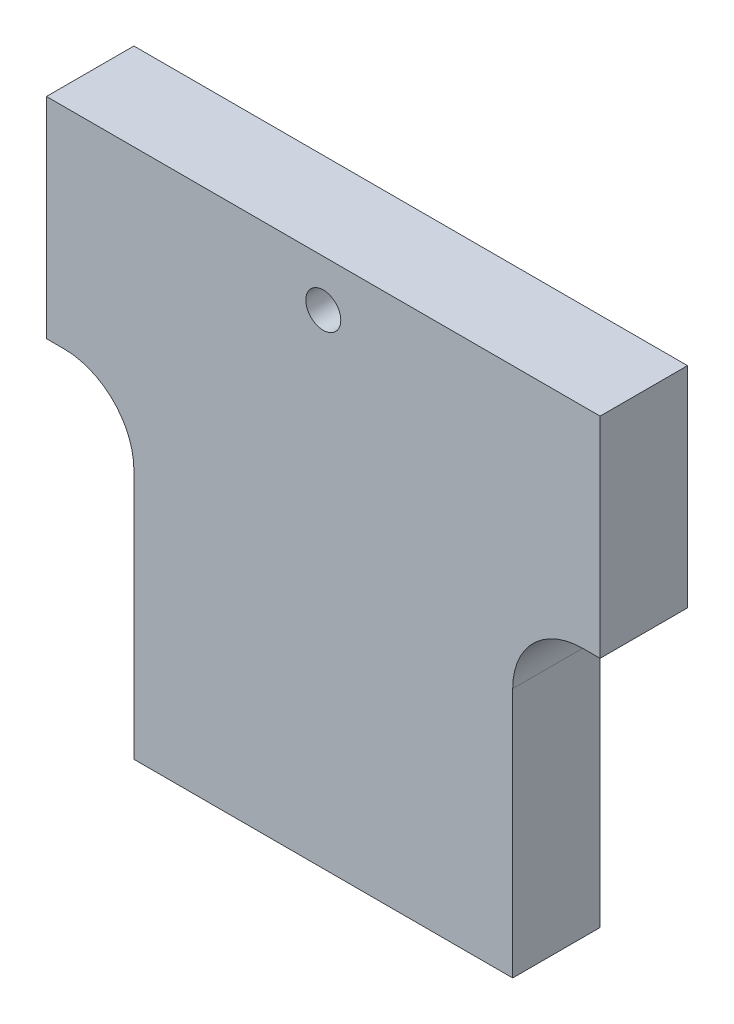
ISO-10303-21;
HEADER;
FILE_DESCRIPTION(('STEP AP214'),'2;1');
FILE_NAME('part.step','',(''),(''),'','','');
FILE_SCHEMA(('AUTOMOTIVE_DESIGN { 1 0 10303 214 1 1 1 1 }'));
ENDSEC;
DATA;
#1=APPLICATION_CONTEXT('core data for automotive mechanical design processes');
#2=APPLICATION_PROTOCOL_DEFINITION('international standard','automotive_design',2000,#1);
#3=PRODUCT_CONTEXT('',#1,'mechanical');
#4=PRODUCT('Part','Part','',(#3));
#5=PRODUCT_RELATED_PRODUCT_CATEGORY('part','',(#4));
#6=PRODUCT_DEFINITION_FORMATION('','',#4);
#7=PRODUCT_DEFINITION_CONTEXT('part definition',#1,'design');
#8=PRODUCT_DEFINITION('design','',#6,#7);
#9=PRODUCT_DEFINITION_SHAPE('','',#8);
#10=(LENGTH_UNIT() NAMED_UNIT(*) SI_UNIT(.MILLI.,.METRE.));
#11=(NAMED_UNIT(*) PLANE_ANGLE_UNIT() SI_UNIT($,.RADIAN.));
#12=(NAMED_UNIT(*) SI_UNIT($,.STERADIAN.) SOLID_ANGLE_UNIT());
#13=UNCERTAINTY_MEASURE_WITH_UNIT(LENGTH_MEASURE(1.E-05),#10,'distance_accuracy_value','');
#14=(GEOMETRIC_REPRESENTATION_CONTEXT(3) GLOBAL_UNCERTAINTY_ASSIGNED_CONTEXT((#13)) GLOBAL_UNIT_ASSIGNED_CONTEXT((#10,
#11,#12)) REPRESENTATION_CONTEXT('',''));
#15=CARTESIAN_POINT('',(0.,0.,0.));
#16=DIRECTION('',(0.,0.,1.));
#17=DIRECTION('',(1.,0.,0.));
#18=AXIS2_PLACEMENT_3D('',#15,#16,#17);
#19=CARTESIAN_POINT('',(0.,0.,150.));
#20=DIRECTION('',(1.,0.,0.));
#21=DIRECTION('',(0.,0.,-1.));
#22=AXIS2_PLACEMENT_3D('',#19,#20,#21);
#23=PLANE('',#22);
#24=DIRECTION('',(0.,-1.,0.));
#25=VECTOR('',#24,1.);
#26=CARTESIAN_POINT('',(0.,0.,0.));
#27=LINE('',#26,#25);
#28=CARTESIAN_POINT('',(0.,910.,0.));
#29=VERTEX_POINT('',#28);
#30=CARTESIAN_POINT('',(0.,550.,0.));
#31=VERTEX_POINT('',#30);
#32=EDGE_CURVE('E128',#29,#31,#27,.T.);
#33=ORIENTED_EDGE('',*,*,#32,.T.);
#34=DIRECTION('',(0.,0.,1.));
#35=VECTOR('',#34,1.);
#36=CARTESIAN_POINT('',(0.,550.,0.));
#37=LINE('',#36,#35);
#38=CARTESIAN_POINT('',(0.,550.,150.));
#39=VERTEX_POINT('',#38);
#40=EDGE_CURVE('E169',#31,#39,#37,.T.);
#41=ORIENTED_EDGE('',*,*,#40,.T.);
#42=DIRECTION('',(0.,-1.,0.));
#43=VECTOR('',#42,1.);
#44=CARTESIAN_POINT('',(0.,0.,150.));
#45=LINE('',#44,#43);
#46=CARTESIAN_POINT('',(0.,910.,150.));
#47=VERTEX_POINT('',#46);
#48=EDGE_CURVE('E121',#47,#39,#45,.T.);
#49=ORIENTED_EDGE('',*,*,#48,.F.);
#50=DIRECTION('',(0.,0.,1.));
#51=VECTOR('',#50,1.);
#52=CARTESIAN_POINT('',(0.,910.,0.));
#53=LINE('',#52,#51);
#54=EDGE_CURVE('E132',#29,#47,#53,.T.);
#55=ORIENTED_EDGE('',*,*,#54,.F.);
#56=EDGE_LOOP('',(#33,#41,#49,#55));
#57=FACE_BOUND('',#56,.T.);
#58=ADVANCED_FACE('F35',(#57),#23,.F.);
#59=CARTESIAN_POINT('',(0.,0.,150.));
#60=DIRECTION('',(0.,1.,0.));
#61=DIRECTION('',(0.,0.,1.));
#62=AXIS2_PLACEMENT_3D('',#59,#60,#61);
#63=PLANE('',#62);
#64=DIRECTION('',(1.,0.,0.));
#65=VECTOR('',#64,1.);
#66=CARTESIAN_POINT('',(0.,0.,0.));
#67=LINE('',#66,#65);
#68=CARTESIAN_POINT('',(150.,0.,0.));
#69=VERTEX_POINT('',#68);
#70=CARTESIAN_POINT('',(800.,0.,0.));
#71=VERTEX_POINT('',#70);
#72=EDGE_CURVE('E122',#69,#71,#67,.T.);
#73=ORIENTED_EDGE('',*,*,#72,.T.);
#74=DIRECTION('',(0.,0.,1.));
#75=VECTOR('',#74,1.);
#76=CARTESIAN_POINT('',(800.,0.,0.));
#77=LINE('',#76,#75);
#78=CARTESIAN_POINT('',(800.,0.,150.));
#79=VERTEX_POINT('',#78);
#80=EDGE_CURVE('E156',#71,#79,#77,.T.);
#81=ORIENTED_EDGE('',*,*,#80,.T.);
#82=DIRECTION('',(1.,0.,0.));
#83=VECTOR('',#82,1.);
#84=CARTESIAN_POINT('',(0.,0.,150.));
#85=LINE('',#84,#83);
#86=CARTESIAN_POINT('',(150.,0.,150.));
#87=VERTEX_POINT('',#86);
#88=EDGE_CURVE('E175',#87,#79,#85,.T.);
#89=ORIENTED_EDGE('',*,*,#88,.F.);
#90=DIRECTION('',(0.,0.,1.));
#91=VECTOR('',#90,1.);
#92=CARTESIAN_POINT('',(150.,0.,0.));
#93=LINE('',#92,#91);
#94=EDGE_CURVE('E166',#69,#87,#93,.T.);
#95=ORIENTED_EDGE('',*,*,#94,.F.);
#96=EDGE_LOOP('',(#73,#81,#89,#95));
#97=FACE_BOUND('',#96,.T.);
#98=ADVANCED_FACE('F220',(#97),#63,.F.);
#99=CARTESIAN_POINT('',(950.,0.,150.));
#100=DIRECTION('',(-1.,0.,0.));
#101=DIRECTION('',(0.,0.,1.));
#102=AXIS2_PLACEMENT_3D('',#99,#100,#101);
#103=PLANE('',#102);
#104=DIRECTION('',(0.,1.,0.));
#105=VECTOR('',#104,1.);
#106=CARTESIAN_POINT('',(950.,0.,150.));
#107=LINE('',#106,#105);
#108=CARTESIAN_POINT('',(950.,550.,150.));
#109=VERTEX_POINT('',#108);
#110=CARTESIAN_POINT('',(950.,910.,150.));
#111=VERTEX_POINT('',#110);
#112=EDGE_CURVE('E178',#109,#111,#107,.T.);
#113=ORIENTED_EDGE('',*,*,#112,.F.);
#114=DIRECTION('',(0.,0.,1.));
#115=VECTOR('',#114,1.);
#116=CARTESIAN_POINT('',(950.,550.,0.));
#117=LINE('',#116,#115);
#118=CARTESIAN_POINT('',(950.,550.,0.));
#119=VERTEX_POINT('',#118);
#120=EDGE_CURVE('E118',#119,#109,#117,.T.);
#121=ORIENTED_EDGE('',*,*,#120,.F.);
#122=DIRECTION('',(0.,1.,0.));
#123=VECTOR('',#122,1.);
#124=CARTESIAN_POINT('',(950.,0.,0.));
#125=LINE('',#124,#123);
#126=CARTESIAN_POINT('',(950.,910.,0.));
#127=VERTEX_POINT('',#126);
#128=EDGE_CURVE('E112',#119,#127,#125,.T.);
#129=ORIENTED_EDGE('',*,*,#128,.T.);
#130=DIRECTION('',(0.,0.,-1.));
#131=VECTOR('',#130,1.);
#132=CARTESIAN_POINT('',(950.,910.,150.));
#133=LINE('',#132,#131);
#134=EDGE_CURVE('E117',#111,#127,#133,.T.);
#135=ORIENTED_EDGE('',*,*,#134,.F.);
#136=EDGE_LOOP('',(#113,#121,#129,#135));
#137=FACE_BOUND('',#136,.T.);
#138=ADVANCED_FACE('F115',(#137),#103,.F.);
#139=CARTESIAN_POINT('',(0.,0.,150.));
#140=DIRECTION('',(0.,0.,-1.));
#141=DIRECTION('',(-1.,0.,0.));
#142=AXIS2_PLACEMENT_3D('',#139,#140,#141);
#143=PLANE('',#142);
#144=CARTESIAN_POINT('',(475.,830.,150.));
#145=DIRECTION('',(0.,0.,1.));
#146=DIRECTION('',(1.,0.,0.));
#147=AXIS2_PLACEMENT_3D('',#144,#145,#146);
#148=CIRCLE('',#147,30.0000000000001);
#149=CARTESIAN_POINT('',(505.,830.,150.));
#150=VERTEX_POINT('',#149);
#151=EDGE_CURVE('E141',#150,#150,#148,.T.);
#152=ORIENTED_EDGE('',*,*,#151,.F.);
#153=EDGE_LOOP('',(#152));
#154=FACE_BOUND('',#153,.T.);
#155=ORIENTED_EDGE('',*,*,#88,.T.);
#156=DIRECTION('',(0.,-1.,0.));
#157=VECTOR('',#156,1.);
#158=CARTESIAN_POINT('',(800.,0.,150.));
#159=LINE('',#158,#157);
#160=CARTESIAN_POINT('',(800.,430.,150.));
#161=VERTEX_POINT('',#160);
#162=EDGE_CURVE('E151',#161,#79,#159,.T.);
#163=ORIENTED_EDGE('',*,*,#162,.F.);
#164=CARTESIAN_POINT('',(920.,430.,150.));
#165=DIRECTION('',(0.,0.,-1.));
#166=DIRECTION('',(-1.,0.,0.));
#167=AXIS2_PLACEMENT_3D('',#164,#165,#166);
#168=CIRCLE('',#167,120.);
#169=CARTESIAN_POINT('',(920.,550.,150.));
#170=VERTEX_POINT('',#169);
#171=EDGE_CURVE('E192',#161,#170,#168,.T.);
#172=ORIENTED_EDGE('',*,*,#171,.T.);
#173=DIRECTION('',(-1.,0.,0.));
#174=VECTOR('',#173,1.);
#175=CARTESIAN_POINT('',(950.,550.,150.));
#176=LINE('',#175,#174);
#177=EDGE_CURVE('E147',#109,#170,#176,.T.);
#178=ORIENTED_EDGE('',*,*,#177,.F.);
#179=ORIENTED_EDGE('',*,*,#112,.T.);
#180=DIRECTION('',(1.,0.,0.));
#181=VECTOR('',#180,1.);
#182=CARTESIAN_POINT('',(0.,910.,150.));
#183=LINE('',#182,#181);
#184=EDGE_CURVE('E137',#47,#111,#183,.T.);
#185=ORIENTED_EDGE('',*,*,#184,.F.);
#186=ORIENTED_EDGE('',*,*,#48,.T.);
#187=DIRECTION('',(-1.,0.,0.));
#188=VECTOR('',#187,1.);
#189=CARTESIAN_POINT('',(0.,550.,150.));
#190=LINE('',#189,#188);
#191=CARTESIAN_POINT('',(30.,550.,150.));
#192=VERTEX_POINT('',#191);
#193=EDGE_CURVE('E164',#192,#39,#190,.T.);
#194=ORIENTED_EDGE('',*,*,#193,.F.);
#195=CARTESIAN_POINT('',(30.,430.,150.));
#196=DIRECTION('',(0.,0.,-1.));
#197=DIRECTION('',(-1.,0.,0.));
#198=AXIS2_PLACEMENT_3D('',#195,#196,#197);
#199=CIRCLE('',#198,120.);
#200=CARTESIAN_POINT('',(150.,430.,150.));
#201=VERTEX_POINT('',#200);
#202=EDGE_CURVE('E43',#192,#201,#199,.T.);
#203=ORIENTED_EDGE('',*,*,#202,.T.);
#204=DIRECTION('',(0.,1.,0.));
#205=VECTOR('',#204,1.);
#206=CARTESIAN_POINT('',(150.,0.,150.));
#207=LINE('',#206,#205);
#208=EDGE_CURVE('E159',#87,#201,#207,.T.);
#209=ORIENTED_EDGE('',*,*,#208,.F.);
#210=EDGE_LOOP('',(#155,#163,#172,#178,#179,#185,#186,#194,#203,#209));
#211=FACE_BOUND('',#210,.T.);
#212=ADVANCED_FACE('F207',(#154,#211),#143,.F.);
#213=CARTESIAN_POINT('',(0.,0.,0.));
#214=DIRECTION('',(0.,0.,-1.));
#215=DIRECTION('',(-1.,0.,0.));
#216=AXIS2_PLACEMENT_3D('',#213,#214,#215);
#217=PLANE('',#216);
#218=CARTESIAN_POINT('',(475.,830.,0.));
#219=DIRECTION('',(0.,0.,-1.));
#220=DIRECTION('',(-1.,0.,0.));
#221=AXIS2_PLACEMENT_3D('',#218,#219,#220);
#222=CIRCLE('',#221,30.0000000000001);
#223=CARTESIAN_POINT('',(445.,830.,0.));
#224=VERTEX_POINT('',#223);
#225=EDGE_CURVE('E138',#224,#224,#222,.F.);
#226=ORIENTED_EDGE('',*,*,#225,.T.);
#227=EDGE_LOOP('',(#226));
#228=FACE_BOUND('',#227,.T.);
#229=DIRECTION('',(-1.,0.,0.));
#230=VECTOR('',#229,1.);
#231=CARTESIAN_POINT('',(950.,550.,0.));
#232=LINE('',#231,#230);
#233=CARTESIAN_POINT('',(920.,550.,0.));
#234=VERTEX_POINT('',#233);
#235=EDGE_CURVE('E148',#119,#234,#232,.T.);
#236=ORIENTED_EDGE('',*,*,#235,.T.);
#237=CARTESIAN_POINT('',(920.,430.,0.));
#238=DIRECTION('',(0.,0.,-1.));
#239=DIRECTION('',(-1.,0.,0.));
#240=AXIS2_PLACEMENT_3D('',#237,#238,#239);
#241=CIRCLE('',#240,120.);
#242=CARTESIAN_POINT('',(800.,430.,0.));
#243=VERTEX_POINT('',#242);
#244=EDGE_CURVE('E194',#234,#243,#241,.F.);
#245=ORIENTED_EDGE('',*,*,#244,.T.);
#246=DIRECTION('',(0.,-1.,0.));
#247=VECTOR('',#246,1.);
#248=CARTESIAN_POINT('',(800.,0.,0.));
#249=LINE('',#248,#247);
#250=EDGE_CURVE('E150',#243,#71,#249,.T.);
#251=ORIENTED_EDGE('',*,*,#250,.T.);
#252=ORIENTED_EDGE('',*,*,#72,.F.);
#253=DIRECTION('',(0.,1.,0.));
#254=VECTOR('',#253,1.);
#255=CARTESIAN_POINT('',(150.,0.,0.));
#256=LINE('',#255,#254);
#257=CARTESIAN_POINT('',(150.,430.,0.));
#258=VERTEX_POINT('',#257);
#259=EDGE_CURVE('E161',#69,#258,#256,.T.);
#260=ORIENTED_EDGE('',*,*,#259,.T.);
#261=CARTESIAN_POINT('',(30.,430.,0.));
#262=DIRECTION('',(0.,0.,-1.));
#263=DIRECTION('',(-1.,0.,0.));
#264=AXIS2_PLACEMENT_3D('',#261,#262,#263);
#265=CIRCLE('',#264,120.);
#266=CARTESIAN_POINT('',(30.,550.,0.));
#267=VERTEX_POINT('',#266);
#268=EDGE_CURVE('E11',#258,#267,#265,.F.);
#269=ORIENTED_EDGE('',*,*,#268,.T.);
#270=DIRECTION('',(-1.,0.,0.));
#271=VECTOR('',#270,1.);
#272=CARTESIAN_POINT('',(0.,550.,0.));
#273=LINE('',#272,#271);
#274=EDGE_CURVE('E163',#267,#31,#273,.T.);
#275=ORIENTED_EDGE('',*,*,#274,.T.);
#276=ORIENTED_EDGE('',*,*,#32,.F.);
#277=DIRECTION('',(-1.,0.,0.));
#278=VECTOR('',#277,1.);
#279=CARTESIAN_POINT('',(950.,910.,0.));
#280=LINE('',#279,#278);
#281=EDGE_CURVE('E125',#127,#29,#280,.T.);
#282=ORIENTED_EDGE('',*,*,#281,.F.);
#283=ORIENTED_EDGE('',*,*,#128,.F.);
#284=EDGE_LOOP('',(#236,#245,#251,#252,#260,#269,#275,#276,#282,#283));
#285=FACE_BOUND('',#284,.T.);
#286=ADVANCED_FACE('F126',(#228,#285),#217,.T.);
#287=CARTESIAN_POINT('',(0.,550.,0.));
#288=DIRECTION('',(0.,1.,0.));
#289=DIRECTION('',(0.,0.,1.));
#290=AXIS2_PLACEMENT_3D('',#287,#288,#289);
#291=PLANE('',#290);
#292=ORIENTED_EDGE('',*,*,#274,.F.);
#293=DIRECTION('',(0.,0.,1.));
#294=VECTOR('',#293,1.);
#295=CARTESIAN_POINT('',(30.,550.,150.));
#296=LINE('',#295,#294);
#297=EDGE_CURVE('E188',#267,#192,#296,.T.);
#298=ORIENTED_EDGE('',*,*,#297,.T.);
#299=ORIENTED_EDGE('',*,*,#193,.T.);
#300=ORIENTED_EDGE('',*,*,#40,.F.);
#301=EDGE_LOOP('',(#292,#298,#299,#300));
#302=FACE_BOUND('',#301,.T.);
#303=ADVANCED_FACE('F233',(#302),#291,.F.);
#304=CARTESIAN_POINT('',(150.,0.,0.));
#305=DIRECTION('',(1.,0.,0.));
#306=DIRECTION('',(0.,0.,-1.));
#307=AXIS2_PLACEMENT_3D('',#304,#305,#306);
#308=PLANE('',#307);
#309=ORIENTED_EDGE('',*,*,#208,.T.);
#310=DIRECTION('',(0.,0.,1.));
#311=VECTOR('',#310,1.);
#312=CARTESIAN_POINT('',(150.,430.,0.));
#313=LINE('',#312,#311);
#314=EDGE_CURVE('E50',#201,#258,#313,.F.);
#315=ORIENTED_EDGE('',*,*,#314,.T.);
#316=ORIENTED_EDGE('',*,*,#259,.F.);
#317=ORIENTED_EDGE('',*,*,#94,.T.);
#318=EDGE_LOOP('',(#309,#315,#316,#317));
#319=FACE_BOUND('',#318,.T.);
#320=ADVANCED_FACE('F216',(#319),#308,.F.);
#321=CARTESIAN_POINT('',(800.,0.,0.));
#322=DIRECTION('',(-1.,0.,0.));
#323=DIRECTION('',(0.,0.,1.));
#324=AXIS2_PLACEMENT_3D('',#321,#322,#323);
#325=PLANE('',#324);
#326=ORIENTED_EDGE('',*,*,#250,.F.);
#327=DIRECTION('',(0.,0.,1.));
#328=VECTOR('',#327,1.);
#329=CARTESIAN_POINT('',(800.,430.,150.));
#330=LINE('',#329,#328);
#331=EDGE_CURVE('E180',#243,#161,#330,.T.);
#332=ORIENTED_EDGE('',*,*,#331,.T.);
#333=ORIENTED_EDGE('',*,*,#162,.T.);
#334=ORIENTED_EDGE('',*,*,#80,.F.);
#335=EDGE_LOOP('',(#326,#332,#333,#334));
#336=FACE_BOUND('',#335,.T.);
#337=ADVANCED_FACE('F203',(#336),#325,.F.);
#338=CARTESIAN_POINT('',(950.,550.,0.));
#339=DIRECTION('',(0.,1.,0.));
#340=DIRECTION('',(0.,0.,1.));
#341=AXIS2_PLACEMENT_3D('',#338,#339,#340);
#342=PLANE('',#341);
#343=ORIENTED_EDGE('',*,*,#177,.T.);
#344=DIRECTION('',(0.,0.,1.));
#345=VECTOR('',#344,1.);
#346=CARTESIAN_POINT('',(920.,550.,0.));
#347=LINE('',#346,#345);
#348=EDGE_CURVE('E186',#170,#234,#347,.F.);
#349=ORIENTED_EDGE('',*,*,#348,.T.);
#350=ORIENTED_EDGE('',*,*,#235,.F.);
#351=ORIENTED_EDGE('',*,*,#120,.T.);
#352=EDGE_LOOP('',(#343,#349,#350,#351));
#353=FACE_BOUND('',#352,.T.);
#354=ADVANCED_FACE('F209',(#353),#342,.F.);
#355=CARTESIAN_POINT('',(920.,430.,0.));
#356=DIRECTION('',(0.,0.,-1.));
#357=DIRECTION('',(-1.,0.,0.));
#358=AXIS2_PLACEMENT_3D('',#355,#356,#357);
#359=CYLINDRICAL_SURFACE('',#358,120.);
#360=ORIENTED_EDGE('',*,*,#244,.F.);
#361=ORIENTED_EDGE('',*,*,#348,.F.);
#362=ORIENTED_EDGE('',*,*,#171,.F.);
#363=ORIENTED_EDGE('',*,*,#331,.F.);
#364=EDGE_LOOP('',(#360,#361,#362,#363));
#365=FACE_BOUND('',#364,.T.);
#366=ADVANCED_FACE('F205',(#365),#359,.F.);
#367=CARTESIAN_POINT('',(30.,430.,0.));
#368=DIRECTION('',(0.,0.,-1.));
#369=DIRECTION('',(-1.,0.,0.));
#370=AXIS2_PLACEMENT_3D('',#367,#368,#369);
#371=CYLINDRICAL_SURFACE('',#370,120.);
#372=ORIENTED_EDGE('',*,*,#268,.F.);
#373=ORIENTED_EDGE('',*,*,#314,.F.);
#374=ORIENTED_EDGE('',*,*,#202,.F.);
#375=ORIENTED_EDGE('',*,*,#297,.F.);
#376=EDGE_LOOP('',(#372,#373,#374,#375));
#377=FACE_BOUND('',#376,.T.);
#378=ADVANCED_FACE('F37',(#377),#371,.F.);
#379=CARTESIAN_POINT('',(0.,910.,0.));
#380=DIRECTION('',(0.,1.,0.));
#381=DIRECTION('',(0.,0.,1.));
#382=AXIS2_PLACEMENT_3D('',#379,#380,#381);
#383=PLANE('',#382);
#384=ORIENTED_EDGE('',*,*,#134,.T.);
#385=ORIENTED_EDGE('',*,*,#281,.T.);
#386=ORIENTED_EDGE('',*,*,#54,.T.);
#387=ORIENTED_EDGE('',*,*,#184,.T.);
#388=EDGE_LOOP('',(#384,#385,#386,#387));
#389=FACE_BOUND('',#388,.T.);
#390=ADVANCED_FACE('F135',(#389),#383,.T.);
#391=CARTESIAN_POINT('',(475.,830.,-84.8528137423858));
#392=DIRECTION('',(0.,0.,1.));
#393=DIRECTION('',(1.,0.,0.));
#394=AXIS2_PLACEMENT_3D('',#391,#392,#393);
#395=CYLINDRICAL_SURFACE('',#394,30.0000000000001);
#396=ORIENTED_EDGE('',*,*,#151,.T.);
#397=EDGE_LOOP('',(#396));
#398=FACE_BOUND('',#397,.T.);
#399=ORIENTED_EDGE('',*,*,#225,.F.);
#400=EDGE_LOOP('',(#399));
#401=FACE_BOUND('',#400,.T.);
#402=ADVANCED_FACE('F254',(#398,#401),#395,.F.);
#403=CLOSED_SHELL('',(#58,#98,#138,#212,#286,#303,#320,#337,#354,#366,#378,#390,#402));
#404=MANIFOLD_SOLID_BREP('B2',#403);
#405=ADVANCED_BREP_SHAPE_REPRESENTATION('',(#18,#404),#14);
#406=SHAPE_DEFINITION_REPRESENTATION(#9,#405);
ENDSEC;
END-ISO-10303-21;
